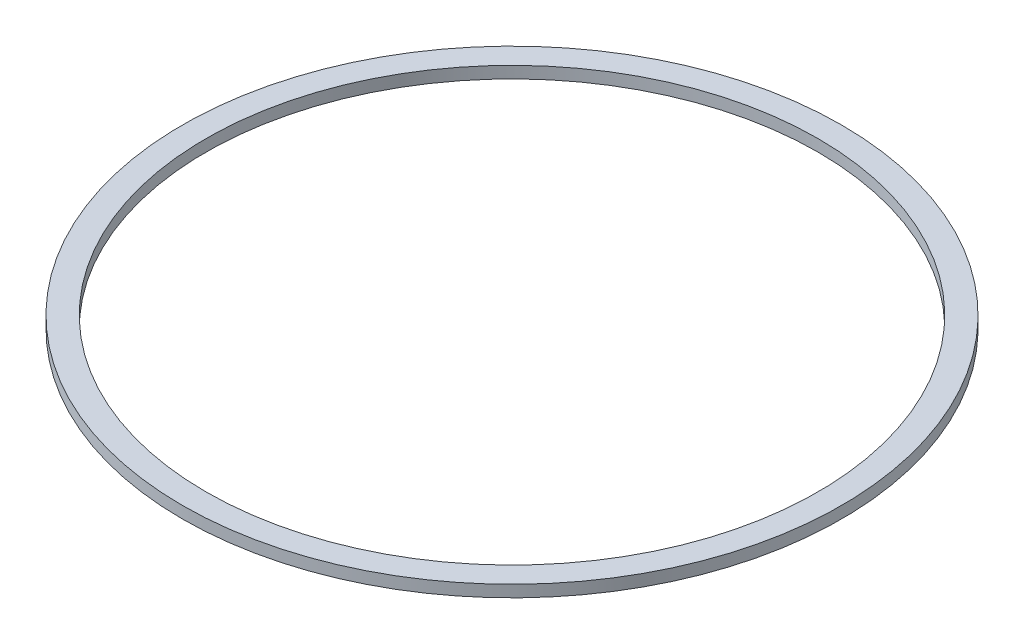
ISO-10303-21;
HEADER;
FILE_DESCRIPTION(('STEP AP214'),'2;1');
FILE_NAME('part.step','',(''),(''),'','','');
FILE_SCHEMA(('AUTOMOTIVE_DESIGN { 1 0 10303 214 1 1 1 1 }'));
ENDSEC;
DATA;
#1=APPLICATION_CONTEXT('core data for automotive mechanical design processes');
#2=APPLICATION_PROTOCOL_DEFINITION('international standard','automotive_design',2000,#1);
#3=PRODUCT_CONTEXT('',#1,'mechanical');
#4=PRODUCT('Part','Part','',(#3));
#5=PRODUCT_RELATED_PRODUCT_CATEGORY('part','',(#4));
#6=PRODUCT_DEFINITION_FORMATION('','',#4);
#7=PRODUCT_DEFINITION_CONTEXT('part definition',#1,'design');
#8=PRODUCT_DEFINITION('design','',#6,#7);
#9=PRODUCT_DEFINITION_SHAPE('','',#8);
#10=(LENGTH_UNIT() NAMED_UNIT(*) SI_UNIT(.MILLI.,.METRE.));
#11=(NAMED_UNIT(*) PLANE_ANGLE_UNIT() SI_UNIT($,.RADIAN.));
#12=(NAMED_UNIT(*) SI_UNIT($,.STERADIAN.) SOLID_ANGLE_UNIT());
#13=UNCERTAINTY_MEASURE_WITH_UNIT(LENGTH_MEASURE(1.E-05),#10,'distance_accuracy_value','');
#14=(GEOMETRIC_REPRESENTATION_CONTEXT(3) GLOBAL_UNCERTAINTY_ASSIGNED_CONTEXT((#13)) GLOBAL_UNIT_ASSIGNED_CONTEXT((#10,
#11,#12)) REPRESENTATION_CONTEXT('',''));
#15=CARTESIAN_POINT('',(0.,0.,0.));
#16=DIRECTION('',(0.,0.,1.));
#17=DIRECTION('',(1.,0.,0.));
#18=AXIS2_PLACEMENT_3D('',#15,#16,#17);
#19=CARTESIAN_POINT('',(-19.0091828831705,-237.,-53.2448828787845));
#20=DIRECTION('',(0.,-1.,0.));
#21=DIRECTION('',(0.,0.,-1.));
#22=AXIS2_PLACEMENT_3D('',#19,#20,#21);
#23=CYLINDRICAL_SURFACE('',#22,14.);
#24=CARTESIAN_POINT('',(-19.0091828831705,-237.,-53.2448828787845));
#25=DIRECTION('',(0.,1.,0.));
#26=DIRECTION('',(0.,0.,1.));
#27=AXIS2_PLACEMENT_3D('',#24,#25,#26);
#28=CIRCLE('',#27,14.);
#29=CARTESIAN_POINT('',(-19.0091828831705,-237.,-39.2448828787845));
#30=VERTEX_POINT('',#29);
#31=EDGE_CURVE('E10',#30,#30,#28,.T.);
#32=ORIENTED_EDGE('',*,*,#31,.F.);
#33=EDGE_LOOP('',(#32));
#34=FACE_BOUND('',#33,.T.);
#35=CARTESIAN_POINT('',(-19.0091828831705,-237.5,-53.2448828787845));
#36=DIRECTION('',(0.,1.,0.));
#37=DIRECTION('',(0.,0.,1.));
#38=AXIS2_PLACEMENT_3D('',#35,#36,#37);
#39=CIRCLE('',#38,14.);
#40=CARTESIAN_POINT('',(-19.0091828831705,-237.5,-39.2448828787845));
#41=VERTEX_POINT('',#40);
#42=EDGE_CURVE('E46',#41,#41,#39,.T.);
#43=ORIENTED_EDGE('',*,*,#42,.T.);
#44=EDGE_LOOP('',(#43));
#45=FACE_BOUND('',#44,.T.);
#46=ADVANCED_FACE('F39',(#34,#45),#23,.T.);
#47=CARTESIAN_POINT('',(-19.0091828831705,-237.,-53.2448828787845));
#48=DIRECTION('',(0.,1.,0.));
#49=DIRECTION('',(0.,0.,1.));
#50=AXIS2_PLACEMENT_3D('',#47,#48,#49);
#51=PLANE('',#50);
#52=CARTESIAN_POINT('',(-19.0091828831705,-237.,-53.2448828787845));
#53=DIRECTION('',(0.,1.,0.));
#54=DIRECTION('',(0.,0.,1.));
#55=AXIS2_PLACEMENT_3D('',#52,#53,#54);
#56=CIRCLE('',#55,13.);
#57=CARTESIAN_POINT('',(-19.0091828831705,-237.,-40.2448828787845));
#58=VERTEX_POINT('',#57);
#59=EDGE_CURVE('E51',#58,#58,#56,.F.);
#60=ORIENTED_EDGE('',*,*,#59,.T.);
#61=EDGE_LOOP('',(#60));
#62=FACE_BOUND('',#61,.T.);
#63=ORIENTED_EDGE('',*,*,#31,.T.);
#64=EDGE_LOOP('',(#63));
#65=FACE_BOUND('',#64,.T.);
#66=ADVANCED_FACE('F63',(#62,#65),#51,.T.);
#67=CARTESIAN_POINT('',(-19.0091828831705,-237.5,-53.2448828787845));
#68=DIRECTION('',(0.,1.,0.));
#69=DIRECTION('',(0.,0.,1.));
#70=AXIS2_PLACEMENT_3D('',#67,#68,#69);
#71=PLANE('',#70);
#72=CARTESIAN_POINT('',(-19.0091828831705,-237.5,-53.2448828787845));
#73=DIRECTION('',(0.,1.,0.));
#74=DIRECTION('',(0.,0.,1.));
#75=AXIS2_PLACEMENT_3D('',#72,#73,#74);
#76=CIRCLE('',#75,13.);
#77=CARTESIAN_POINT('',(-19.0091828831705,-237.5,-40.2448828787845));
#78=VERTEX_POINT('',#77);
#79=EDGE_CURVE('E45',#78,#78,#76,.F.);
#80=ORIENTED_EDGE('',*,*,#79,.F.);
#81=EDGE_LOOP('',(#80));
#82=FACE_BOUND('',#81,.T.);
#83=ORIENTED_EDGE('',*,*,#42,.F.);
#84=EDGE_LOOP('',(#83));
#85=FACE_BOUND('',#84,.T.);
#86=ADVANCED_FACE('F61',(#82,#85),#71,.F.);
#87=CARTESIAN_POINT('',(-19.0091828831705,-236.9,-53.2448828787845));
#88=DIRECTION('',(0.,-1.,0.));
#89=DIRECTION('',(0.,0.,-1.));
#90=AXIS2_PLACEMENT_3D('',#87,#88,#89);
#91=CYLINDRICAL_SURFACE('',#90,13.);
#92=ORIENTED_EDGE('',*,*,#59,.F.);
#93=EDGE_LOOP('',(#92));
#94=FACE_BOUND('',#93,.T.);
#95=ORIENTED_EDGE('',*,*,#79,.T.);
#96=EDGE_LOOP('',(#95));
#97=FACE_BOUND('',#96,.T.);
#98=ADVANCED_FACE('F56',(#94,#97),#91,.F.);
#99=CLOSED_SHELL('',(#46,#66,#86,#98));
#100=MANIFOLD_SOLID_BREP('B2',#99);
#101=ADVANCED_BREP_SHAPE_REPRESENTATION('',(#18,#100),#14);
#102=SHAPE_DEFINITION_REPRESENTATION(#9,#101);
ENDSEC;
END-ISO-10303-21;
